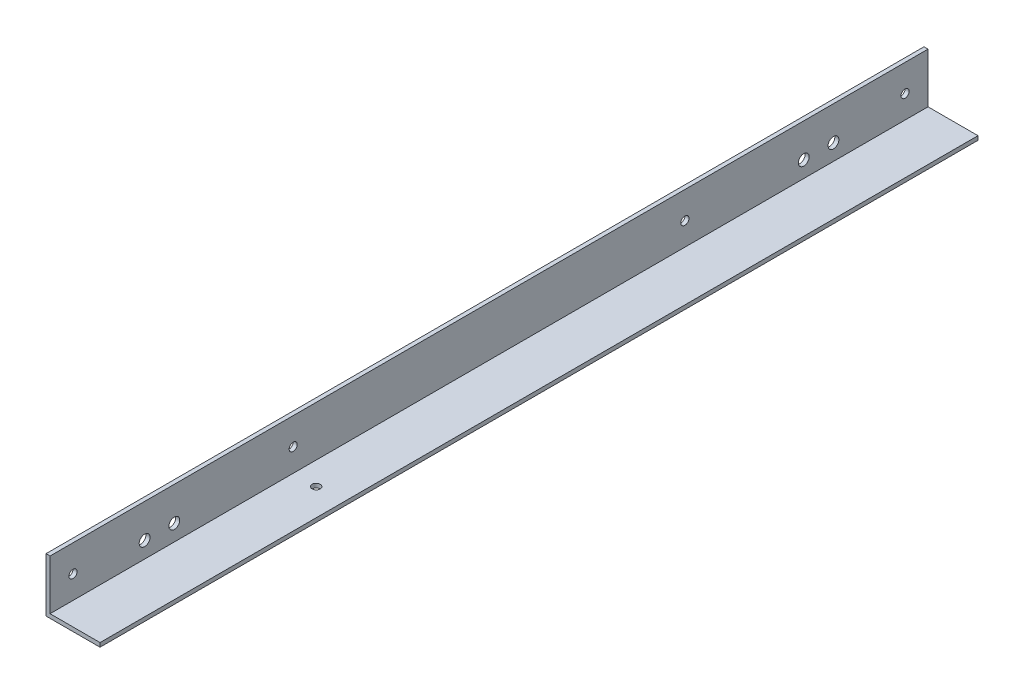
ISO-10303-21;
HEADER;
FILE_DESCRIPTION(('STEP AP214'),'2;1');
FILE_NAME('part.step','',(''),(''),'','','');
FILE_SCHEMA(('AUTOMOTIVE_DESIGN { 1 0 10303 214 1 1 1 1 }'));
ENDSEC;
DATA;
#1=APPLICATION_CONTEXT('core data for automotive mechanical design processes');
#2=APPLICATION_PROTOCOL_DEFINITION('international standard','automotive_design',2000,#1);
#3=PRODUCT_CONTEXT('',#1,'mechanical');
#4=PRODUCT('Part','Part','',(#3));
#5=PRODUCT_RELATED_PRODUCT_CATEGORY('part','',(#4));
#6=PRODUCT_DEFINITION_FORMATION('','',#4);
#7=PRODUCT_DEFINITION_CONTEXT('part definition',#1,'design');
#8=PRODUCT_DEFINITION('design','',#6,#7);
#9=PRODUCT_DEFINITION_SHAPE('','',#8);
#10=(LENGTH_UNIT() NAMED_UNIT(*) SI_UNIT(.MILLI.,.METRE.));
#11=(NAMED_UNIT(*) PLANE_ANGLE_UNIT() SI_UNIT($,.RADIAN.));
#12=(NAMED_UNIT(*) SI_UNIT($,.STERADIAN.) SOLID_ANGLE_UNIT());
#13=UNCERTAINTY_MEASURE_WITH_UNIT(LENGTH_MEASURE(1.E-05),#10,'distance_accuracy_value','');
#14=(GEOMETRIC_REPRESENTATION_CONTEXT(3) GLOBAL_UNCERTAINTY_ASSIGNED_CONTEXT((#13)) GLOBAL_UNIT_ASSIGNED_CONTEXT((#10,
#11,#12)) REPRESENTATION_CONTEXT('',''));
#15=CARTESIAN_POINT('',(0.,0.,0.));
#16=DIRECTION('',(0.,0.,1.));
#17=DIRECTION('',(1.,0.,0.));
#18=AXIS2_PLACEMENT_3D('',#15,#16,#17);
#19=CARTESIAN_POINT('',(-15.9316863798358,4.77336842105263,325.));
#20=DIRECTION('',(0.,-1.,0.));
#21=DIRECTION('',(1.,0.,0.));
#22=AXIS2_PLACEMENT_3D('',#19,#20,#21);
#23=PLANE('',#22);
#24=DIRECTION('',(-1.,0.,0.));
#25=VECTOR('',#24,1.);
#26=CARTESIAN_POINT('',(-15.9316863798358,4.77336842105263,0.));
#27=LINE('',#26,#25);
#28=CARTESIAN_POINT('',(-15.9316863798358,4.77336842105263,0.));
#29=VERTEX_POINT('',#28);
#30=CARTESIAN_POINT('',(-17.4316863798358,4.77336842105263,0.));
#31=VERTEX_POINT('',#30);
#32=EDGE_CURVE('E116',#29,#31,#27,.T.);
#33=ORIENTED_EDGE('',*,*,#32,.T.);
#34=DIRECTION('',(0.,0.,-1.));
#35=VECTOR('',#34,1.);
#36=CARTESIAN_POINT('',(-17.4316863798358,4.77336842105263,325.));
#37=LINE('',#36,#35);
#38=CARTESIAN_POINT('',(-17.4316863798358,4.77336842105263,325.));
#39=VERTEX_POINT('',#38);
#40=EDGE_CURVE('E11',#39,#31,#37,.T.);
#41=ORIENTED_EDGE('',*,*,#40,.F.);
#42=DIRECTION('',(-1.,0.,0.));
#43=VECTOR('',#42,1.);
#44=CARTESIAN_POINT('',(-15.9316863798358,4.77336842105263,325.));
#45=LINE('',#44,#43);
#46=CARTESIAN_POINT('',(-15.9316863798358,4.77336842105263,325.));
#47=VERTEX_POINT('',#46);
#48=EDGE_CURVE('E127',#47,#39,#45,.T.);
#49=ORIENTED_EDGE('',*,*,#48,.F.);
#50=DIRECTION('',(0.,0.,-1.));
#51=VECTOR('',#50,1.);
#52=CARTESIAN_POINT('',(-15.9316863798358,4.77336842105263,325.));
#53=LINE('',#52,#51);
#54=EDGE_CURVE('E112',#47,#29,#53,.T.);
#55=ORIENTED_EDGE('',*,*,#54,.T.);
#56=EDGE_LOOP('',(#33,#41,#49,#55));
#57=FACE_BOUND('',#56,.T.);
#58=ADVANCED_FACE('F31',(#57),#23,.F.);
#59=CARTESIAN_POINT('',(-17.4316863798358,4.77336842105263,325.));
#60=DIRECTION('',(1.,0.,0.));
#61=DIRECTION('',(0.,1.,0.));
#62=AXIS2_PLACEMENT_3D('',#59,#60,#61);
#63=PLANE('',#62);
#64=CARTESIAN_POINT('',(-17.4316863798358,-5.22663157894737,90.));
#65=DIRECTION('',(1.,0.,0.));
#66=DIRECTION('',(0.,1.,0.));
#67=AXIS2_PLACEMENT_3D('',#64,#65,#66);
#68=CIRCLE('',#67,1.5);
#69=CARTESIAN_POINT('',(-17.4316863798358,-3.72663157894737,90.));
#70=VERTEX_POINT('',#69);
#71=EDGE_CURVE('E351',#70,#70,#68,.T.);
#72=ORIENTED_EDGE('',*,*,#71,.T.);
#73=EDGE_LOOP('',(#72));
#74=FACE_BOUND('',#73,.T.);
#75=CARTESIAN_POINT('',(-17.4316863798358,-5.22663157894737,235.));
#76=DIRECTION('',(1.,0.,0.));
#77=DIRECTION('',(0.,1.,0.));
#78=AXIS2_PLACEMENT_3D('',#75,#76,#77);
#79=CIRCLE('',#78,1.50000000000003);
#80=CARTESIAN_POINT('',(-17.4316863798358,-3.72663157894734,235.));
#81=VERTEX_POINT('',#80);
#82=EDGE_CURVE('E345',#81,#81,#79,.T.);
#83=ORIENTED_EDGE('',*,*,#82,.T.);
#84=EDGE_LOOP('',(#83));
#85=FACE_BOUND('',#84,.T.);
#86=CARTESIAN_POINT('',(-17.4316863798358,-7.72663157894737,46.));
#87=DIRECTION('',(1.,0.,0.));
#88=DIRECTION('',(0.,1.,0.));
#89=AXIS2_PLACEMENT_3D('',#86,#87,#88);
#90=CIRCLE('',#89,2.);
#91=CARTESIAN_POINT('',(-17.4316863798358,-5.72663157894737,46.));
#92=VERTEX_POINT('',#91);
#93=EDGE_CURVE('E339',#92,#92,#90,.T.);
#94=ORIENTED_EDGE('',*,*,#93,.T.);
#95=EDGE_LOOP('',(#94));
#96=FACE_BOUND('',#95,.T.);
#97=CARTESIAN_POINT('',(-17.4316863798358,-7.72663157894737,35.));
#98=DIRECTION('',(1.,0.,0.));
#99=DIRECTION('',(0.,1.,0.));
#100=AXIS2_PLACEMENT_3D('',#97,#98,#99);
#101=CIRCLE('',#100,2.);
#102=CARTESIAN_POINT('',(-17.4316863798358,-5.72663157894737,35.));
#103=VERTEX_POINT('',#102);
#104=EDGE_CURVE('E333',#103,#103,#101,.T.);
#105=ORIENTED_EDGE('',*,*,#104,.T.);
#106=EDGE_LOOP('',(#105));
#107=FACE_BOUND('',#106,.T.);
#108=CARTESIAN_POINT('',(-17.4316863798358,-7.72663157894737,279.));
#109=DIRECTION('',(1.,0.,0.));
#110=DIRECTION('',(0.,1.,0.));
#111=AXIS2_PLACEMENT_3D('',#108,#109,#110);
#112=CIRCLE('',#111,2.);
#113=CARTESIAN_POINT('',(-17.4316863798358,-5.72663157894738,279.));
#114=VERTEX_POINT('',#113);
#115=EDGE_CURVE('E327',#114,#114,#112,.T.);
#116=ORIENTED_EDGE('',*,*,#115,.T.);
#117=EDGE_LOOP('',(#116));
#118=FACE_BOUND('',#117,.T.);
#119=CARTESIAN_POINT('',(-17.4316863798358,-7.72663157894737,290.));
#120=DIRECTION('',(1.,0.,0.));
#121=DIRECTION('',(0.,1.,0.));
#122=AXIS2_PLACEMENT_3D('',#119,#120,#121);
#123=CIRCLE('',#122,2.);
#124=CARTESIAN_POINT('',(-17.4316863798358,-5.72663157894738,290.));
#125=VERTEX_POINT('',#124);
#126=EDGE_CURVE('E321',#125,#125,#123,.T.);
#127=ORIENTED_EDGE('',*,*,#126,.T.);
#128=EDGE_LOOP('',(#127));
#129=FACE_BOUND('',#128,.T.);
#130=CARTESIAN_POINT('',(-17.4316863798358,-5.22663157894737,8.50000000000001));
#131=DIRECTION('',(1.,0.,0.));
#132=DIRECTION('',(0.,1.,0.));
#133=AXIS2_PLACEMENT_3D('',#130,#131,#132);
#134=CIRCLE('',#133,1.5);
#135=CARTESIAN_POINT('',(-17.4316863798358,-3.72663157894737,8.50000000000001));
#136=VERTEX_POINT('',#135);
#137=EDGE_CURVE('E311',#136,#136,#134,.T.);
#138=ORIENTED_EDGE('',*,*,#137,.T.);
#139=EDGE_LOOP('',(#138));
#140=FACE_BOUND('',#139,.T.);
#141=CARTESIAN_POINT('',(-17.4316863798358,-5.22663157894737,316.5));
#142=DIRECTION('',(1.,0.,0.));
#143=DIRECTION('',(0.,1.,0.));
#144=AXIS2_PLACEMENT_3D('',#141,#142,#143);
#145=CIRCLE('',#144,1.50000000000002);
#146=CARTESIAN_POINT('',(-17.4316863798358,-3.72663157894735,316.5));
#147=VERTEX_POINT('',#146);
#148=EDGE_CURVE('E120',#147,#147,#145,.T.);
#149=ORIENTED_EDGE('',*,*,#148,.T.);
#150=EDGE_LOOP('',(#149));
#151=FACE_BOUND('',#150,.T.);
#152=DIRECTION('',(0.,-1.,0.));
#153=VECTOR('',#152,1.);
#154=CARTESIAN_POINT('',(-17.4316863798358,4.77336842105263,0.));
#155=LINE('',#154,#153);
#156=CARTESIAN_POINT('',(-17.4316863798357,-15.2266315789474,0.));
#157=VERTEX_POINT('',#156);
#158=EDGE_CURVE('E119',#31,#157,#155,.T.);
#159=ORIENTED_EDGE('',*,*,#158,.T.);
#160=DIRECTION('',(0.,0.,-1.));
#161=VECTOR('',#160,1.);
#162=CARTESIAN_POINT('',(-17.4316863798357,-15.2266315789474,325.));
#163=LINE('',#162,#161);
#164=CARTESIAN_POINT('',(-17.4316863798357,-15.2266315789474,325.));
#165=VERTEX_POINT('',#164);
#166=EDGE_CURVE('E40',#165,#157,#163,.T.);
#167=ORIENTED_EDGE('',*,*,#166,.F.);
#168=DIRECTION('',(0.,-1.,0.));
#169=VECTOR('',#168,1.);
#170=CARTESIAN_POINT('',(-17.4316863798358,4.77336842105263,325.));
#171=LINE('',#170,#169);
#172=EDGE_CURVE('E85',#39,#165,#171,.T.);
#173=ORIENTED_EDGE('',*,*,#172,.F.);
#174=ORIENTED_EDGE('',*,*,#40,.T.);
#175=EDGE_LOOP('',(#159,#167,#173,#174));
#176=FACE_BOUND('',#175,.T.);
#177=ADVANCED_FACE('F156',(#74,#85,#96,#107,#118,#129,#140,#151,#176),#63,.F.);
#178=CARTESIAN_POINT('',(-17.4316863798357,-15.2266315789474,325.));
#179=DIRECTION('',(0.,1.,0.));
#180=DIRECTION('',(0.,0.,1.));
#181=AXIS2_PLACEMENT_3D('',#178,#179,#180);
#182=PLANE('',#181);
#183=CARTESIAN_POINT('',(-7.43168637983575,-15.2266315789474,235.));
#184=DIRECTION('',(0.,-1.,0.));
#185=DIRECTION('',(0.,0.,-1.));
#186=AXIS2_PLACEMENT_3D('',#183,#184,#185);
#187=CIRCLE('',#186,1.5);
#188=CARTESIAN_POINT('',(-7.43168637983575,-15.2266315789474,233.5));
#189=VERTEX_POINT('',#188);
#190=EDGE_CURVE('E356',#189,#189,#187,.T.);
#191=ORIENTED_EDGE('',*,*,#190,.F.);
#192=EDGE_LOOP('',(#191));
#193=FACE_BOUND('',#192,.T.);
#194=DIRECTION('',(1.,0.,0.));
#195=VECTOR('',#194,1.);
#196=CARTESIAN_POINT('',(-17.4316863798357,-15.2266315789474,0.));
#197=LINE('',#196,#195);
#198=CARTESIAN_POINT('',(2.56831362016425,-15.2266315789474,0.));
#199=VERTEX_POINT('',#198);
#200=EDGE_CURVE('E122',#157,#199,#197,.T.);
#201=ORIENTED_EDGE('',*,*,#200,.T.);
#202=DIRECTION('',(0.,0.,-1.));
#203=VECTOR('',#202,1.);
#204=CARTESIAN_POINT('',(2.56831362016425,-15.2266315789474,325.));
#205=LINE('',#204,#203);
#206=CARTESIAN_POINT('',(2.56831362016425,-15.2266315789474,325.));
#207=VERTEX_POINT('',#206);
#208=EDGE_CURVE('E107',#207,#199,#205,.T.);
#209=ORIENTED_EDGE('',*,*,#208,.F.);
#210=DIRECTION('',(1.,0.,0.));
#211=VECTOR('',#210,1.);
#212=CARTESIAN_POINT('',(-17.4316863798357,-15.2266315789474,325.));
#213=LINE('',#212,#211);
#214=EDGE_CURVE('E98',#165,#207,#213,.T.);
#215=ORIENTED_EDGE('',*,*,#214,.F.);
#216=ORIENTED_EDGE('',*,*,#166,.T.);
#217=EDGE_LOOP('',(#201,#209,#215,#216));
#218=FACE_BOUND('',#217,.T.);
#219=ADVANCED_FACE('F134',(#193,#218),#182,.F.);
#220=CARTESIAN_POINT('',(2.56831362016425,-15.2266315789474,325.));
#221=DIRECTION('',(-1.,0.,0.));
#222=DIRECTION('',(0.,0.,1.));
#223=AXIS2_PLACEMENT_3D('',#220,#221,#222);
#224=PLANE('',#223);
#225=DIRECTION('',(0.,1.,0.));
#226=VECTOR('',#225,1.);
#227=CARTESIAN_POINT('',(2.56831362016425,-15.2266315789474,0.));
#228=LINE('',#227,#226);
#229=CARTESIAN_POINT('',(2.56831362016425,-13.7266315789474,0.));
#230=VERTEX_POINT('',#229);
#231=EDGE_CURVE('E106',#199,#230,#228,.T.);
#232=ORIENTED_EDGE('',*,*,#231,.T.);
#233=DIRECTION('',(0.,0.,-1.));
#234=VECTOR('',#233,1.);
#235=CARTESIAN_POINT('',(2.56831362016425,-13.7266315789474,325.));
#236=LINE('',#235,#234);
#237=CARTESIAN_POINT('',(2.56831362016425,-13.7266315789474,325.));
#238=VERTEX_POINT('',#237);
#239=EDGE_CURVE('E103',#238,#230,#236,.T.);
#240=ORIENTED_EDGE('',*,*,#239,.F.);
#241=DIRECTION('',(0.,1.,0.));
#242=VECTOR('',#241,1.);
#243=CARTESIAN_POINT('',(2.56831362016425,-15.2266315789474,325.));
#244=LINE('',#243,#242);
#245=EDGE_CURVE('E92',#207,#238,#244,.T.);
#246=ORIENTED_EDGE('',*,*,#245,.F.);
#247=ORIENTED_EDGE('',*,*,#208,.T.);
#248=EDGE_LOOP('',(#232,#240,#246,#247));
#249=FACE_BOUND('',#248,.T.);
#250=ADVANCED_FACE('F104',(#249),#224,.F.);
#251=CARTESIAN_POINT('',(2.56831362016425,-13.7266315789474,325.));
#252=DIRECTION('',(0.,-1.,0.));
#253=DIRECTION('',(1.,0.,0.));
#254=AXIS2_PLACEMENT_3D('',#251,#252,#253);
#255=PLANE('',#254);
#256=CARTESIAN_POINT('',(-7.43168637983575,-13.7266315789474,235.));
#257=DIRECTION('',(0.,-1.,0.));
#258=DIRECTION('',(1.,0.,0.));
#259=AXIS2_PLACEMENT_3D('',#256,#257,#258);
#260=CIRCLE('',#259,1.5);
#261=CARTESIAN_POINT('',(-5.93168637983575,-13.7266315789474,235.));
#262=VERTEX_POINT('',#261);
#263=EDGE_CURVE('E34',#262,#262,#260,.T.);
#264=ORIENTED_EDGE('',*,*,#263,.T.);
#265=EDGE_LOOP('',(#264));
#266=FACE_BOUND('',#265,.T.);
#267=DIRECTION('',(-1.,0.,0.));
#268=VECTOR('',#267,1.);
#269=CARTESIAN_POINT('',(2.56831362016425,-13.7266315789474,0.));
#270=LINE('',#269,#268);
#271=CARTESIAN_POINT('',(-15.9316863798358,-13.7266315789474,0.));
#272=VERTEX_POINT('',#271);
#273=EDGE_CURVE('E71',#230,#272,#270,.T.);
#274=ORIENTED_EDGE('',*,*,#273,.T.);
#275=DIRECTION('',(0.,0.,-1.));
#276=VECTOR('',#275,1.);
#277=CARTESIAN_POINT('',(-15.9316863798358,-13.7266315789474,325.));
#278=LINE('',#277,#276);
#279=CARTESIAN_POINT('',(-15.9316863798358,-13.7266315789474,325.));
#280=VERTEX_POINT('',#279);
#281=EDGE_CURVE('E108',#280,#272,#278,.T.);
#282=ORIENTED_EDGE('',*,*,#281,.F.);
#283=DIRECTION('',(-1.,0.,0.));
#284=VECTOR('',#283,1.);
#285=CARTESIAN_POINT('',(2.56831362016425,-13.7266315789474,325.));
#286=LINE('',#285,#284);
#287=EDGE_CURVE('E96',#238,#280,#286,.T.);
#288=ORIENTED_EDGE('',*,*,#287,.F.);
#289=ORIENTED_EDGE('',*,*,#239,.T.);
#290=EDGE_LOOP('',(#274,#282,#288,#289));
#291=FACE_BOUND('',#290,.T.);
#292=ADVANCED_FACE('F110',(#266,#291),#255,.F.);
#293=CARTESIAN_POINT('',(-15.9316863798358,-13.7266315789474,325.));
#294=DIRECTION('',(-1.,0.,0.));
#295=DIRECTION('',(0.,0.,1.));
#296=AXIS2_PLACEMENT_3D('',#293,#294,#295);
#297=PLANE('',#296);
#298=CARTESIAN_POINT('',(-15.9316863798358,-5.22663157894737,90.));
#299=DIRECTION('',(1.,0.,0.));
#300=DIRECTION('',(0.,0.,-1.));
#301=AXIS2_PLACEMENT_3D('',#298,#299,#300);
#302=CIRCLE('',#301,1.5);
#303=CARTESIAN_POINT('',(-15.9316863798358,-5.22663157894737,88.5));
#304=VERTEX_POINT('',#303);
#305=EDGE_CURVE('E353',#304,#304,#302,.T.);
#306=ORIENTED_EDGE('',*,*,#305,.F.);
#307=EDGE_LOOP('',(#306));
#308=FACE_BOUND('',#307,.T.);
#309=CARTESIAN_POINT('',(-15.9316863798358,-5.22663157894737,235.));
#310=DIRECTION('',(1.,0.,0.));
#311=DIRECTION('',(0.,0.,-1.));
#312=AXIS2_PLACEMENT_3D('',#309,#310,#311);
#313=CIRCLE('',#312,1.50000000000003);
#314=CARTESIAN_POINT('',(-15.9316863798358,-5.22663157894737,233.5));
#315=VERTEX_POINT('',#314);
#316=EDGE_CURVE('E348',#315,#315,#313,.T.);
#317=ORIENTED_EDGE('',*,*,#316,.F.);
#318=EDGE_LOOP('',(#317));
#319=FACE_BOUND('',#318,.T.);
#320=CARTESIAN_POINT('',(-15.9316863798358,-7.72663157894737,46.));
#321=DIRECTION('',(1.,0.,0.));
#322=DIRECTION('',(0.,0.,-1.));
#323=AXIS2_PLACEMENT_3D('',#320,#321,#322);
#324=CIRCLE('',#323,2.);
#325=CARTESIAN_POINT('',(-15.9316863798358,-7.72663157894737,44.));
#326=VERTEX_POINT('',#325);
#327=EDGE_CURVE('E342',#326,#326,#324,.T.);
#328=ORIENTED_EDGE('',*,*,#327,.F.);
#329=EDGE_LOOP('',(#328));
#330=FACE_BOUND('',#329,.T.);
#331=CARTESIAN_POINT('',(-15.9316863798358,-7.72663157894737,35.));
#332=DIRECTION('',(1.,0.,0.));
#333=DIRECTION('',(0.,0.,-1.));
#334=AXIS2_PLACEMENT_3D('',#331,#332,#333);
#335=CIRCLE('',#334,2.);
#336=CARTESIAN_POINT('',(-15.9316863798358,-7.72663157894737,33.));
#337=VERTEX_POINT('',#336);
#338=EDGE_CURVE('E336',#337,#337,#335,.T.);
#339=ORIENTED_EDGE('',*,*,#338,.F.);
#340=EDGE_LOOP('',(#339));
#341=FACE_BOUND('',#340,.T.);
#342=CARTESIAN_POINT('',(-15.9316863798358,-7.72663157894737,279.));
#343=DIRECTION('',(1.,0.,0.));
#344=DIRECTION('',(0.,0.,-1.));
#345=AXIS2_PLACEMENT_3D('',#342,#343,#344);
#346=CIRCLE('',#345,2.);
#347=CARTESIAN_POINT('',(-15.9316863798358,-7.72663157894737,277.));
#348=VERTEX_POINT('',#347);
#349=EDGE_CURVE('E330',#348,#348,#346,.T.);
#350=ORIENTED_EDGE('',*,*,#349,.F.);
#351=EDGE_LOOP('',(#350));
#352=FACE_BOUND('',#351,.T.);
#353=CARTESIAN_POINT('',(-15.9316863798358,-7.72663157894737,290.));
#354=DIRECTION('',(1.,0.,0.));
#355=DIRECTION('',(0.,0.,-1.));
#356=AXIS2_PLACEMENT_3D('',#353,#354,#355);
#357=CIRCLE('',#356,2.);
#358=CARTESIAN_POINT('',(-15.9316863798358,-7.72663157894737,288.));
#359=VERTEX_POINT('',#358);
#360=EDGE_CURVE('E324',#359,#359,#357,.T.);
#361=ORIENTED_EDGE('',*,*,#360,.F.);
#362=EDGE_LOOP('',(#361));
#363=FACE_BOUND('',#362,.T.);
#364=CARTESIAN_POINT('',(-15.9316863798358,-5.22663157894737,8.50000000000001));
#365=DIRECTION('',(1.,0.,0.));
#366=DIRECTION('',(0.,0.,-1.));
#367=AXIS2_PLACEMENT_3D('',#364,#365,#366);
#368=CIRCLE('',#367,1.5);
#369=CARTESIAN_POINT('',(-15.9316863798358,-5.22663157894737,7.00000000000001));
#370=VERTEX_POINT('',#369);
#371=EDGE_CURVE('E318',#370,#370,#368,.T.);
#372=ORIENTED_EDGE('',*,*,#371,.F.);
#373=EDGE_LOOP('',(#372));
#374=FACE_BOUND('',#373,.T.);
#375=CARTESIAN_POINT('',(-15.9316863798358,-5.22663157894737,316.5));
#376=DIRECTION('',(1.,0.,0.));
#377=DIRECTION('',(0.,0.,-1.));
#378=AXIS2_PLACEMENT_3D('',#375,#376,#377);
#379=CIRCLE('',#378,1.50000000000002);
#380=CARTESIAN_POINT('',(-15.9316863798358,-5.22663157894737,315.));
#381=VERTEX_POINT('',#380);
#382=EDGE_CURVE('E306',#381,#381,#379,.T.);
#383=ORIENTED_EDGE('',*,*,#382,.F.);
#384=EDGE_LOOP('',(#383));
#385=FACE_BOUND('',#384,.T.);
#386=DIRECTION('',(0.,1.,0.));
#387=VECTOR('',#386,1.);
#388=CARTESIAN_POINT('',(-15.9316863798358,-13.7266315789474,0.));
#389=LINE('',#388,#387);
#390=EDGE_CURVE('E77',#272,#29,#389,.T.);
#391=ORIENTED_EDGE('',*,*,#390,.T.);
#392=ORIENTED_EDGE('',*,*,#54,.F.);
#393=DIRECTION('',(0.,1.,0.));
#394=VECTOR('',#393,1.);
#395=CARTESIAN_POINT('',(-15.9316863798358,-13.7266315789474,325.));
#396=LINE('',#395,#394);
#397=EDGE_CURVE('E48',#280,#47,#396,.T.);
#398=ORIENTED_EDGE('',*,*,#397,.F.);
#399=ORIENTED_EDGE('',*,*,#281,.T.);
#400=EDGE_LOOP('',(#391,#392,#398,#399));
#401=FACE_BOUND('',#400,.T.);
#402=ADVANCED_FACE('F141',(#308,#319,#330,#341,#352,#363,#374,#385,#401),#297,.F.);
#403=CARTESIAN_POINT('',(-17.4316863798358,4.77336842105263,325.));
#404=DIRECTION('',(0.,0.,1.));
#405=DIRECTION('',(1.,0.,0.));
#406=AXIS2_PLACEMENT_3D('',#403,#404,#405);
#407=PLANE('',#406);
#408=ORIENTED_EDGE('',*,*,#48,.T.);
#409=ORIENTED_EDGE('',*,*,#172,.T.);
#410=ORIENTED_EDGE('',*,*,#214,.T.);
#411=ORIENTED_EDGE('',*,*,#245,.T.);
#412=ORIENTED_EDGE('',*,*,#287,.T.);
#413=ORIENTED_EDGE('',*,*,#397,.T.);
#414=EDGE_LOOP('',(#408,#409,#410,#411,#412,#413));
#415=FACE_BOUND('',#414,.T.);
#416=ADVANCED_FACE('F94',(#415),#407,.T.);
#417=CARTESIAN_POINT('',(-17.4316863798358,4.77336842105263,0.));
#418=DIRECTION('',(0.,0.,1.));
#419=DIRECTION('',(1.,0.,0.));
#420=AXIS2_PLACEMENT_3D('',#417,#418,#419);
#421=PLANE('',#420);
#422=ORIENTED_EDGE('',*,*,#32,.F.);
#423=ORIENTED_EDGE('',*,*,#390,.F.);
#424=ORIENTED_EDGE('',*,*,#273,.F.);
#425=ORIENTED_EDGE('',*,*,#231,.F.);
#426=ORIENTED_EDGE('',*,*,#200,.F.);
#427=ORIENTED_EDGE('',*,*,#158,.F.);
#428=EDGE_LOOP('',(#422,#423,#424,#425,#426,#427));
#429=FACE_BOUND('',#428,.T.);
#430=ADVANCED_FACE('F137',(#429),#421,.F.);
#431=CARTESIAN_POINT('',(-315.931686379836,-5.22663157894737,316.5));
#432=DIRECTION('',(1.,0.,0.));
#433=DIRECTION('',(0.,0.,-1.));
#434=AXIS2_PLACEMENT_3D('',#431,#432,#433);
#435=CYLINDRICAL_SURFACE('',#434,1.50000000000002);
#436=ORIENTED_EDGE('',*,*,#382,.T.);
#437=EDGE_LOOP('',(#436));
#438=FACE_BOUND('',#437,.T.);
#439=ORIENTED_EDGE('',*,*,#148,.F.);
#440=EDGE_LOOP('',(#439));
#441=FACE_BOUND('',#440,.T.);
#442=ADVANCED_FACE('F249',(#438,#441),#435,.F.);
#443=CARTESIAN_POINT('',(-315.931686379836,-5.22663157894737,8.50000000000001));
#444=DIRECTION('',(1.,0.,0.));
#445=DIRECTION('',(0.,0.,-1.));
#446=AXIS2_PLACEMENT_3D('',#443,#444,#445);
#447=CYLINDRICAL_SURFACE('',#446,1.5);
#448=ORIENTED_EDGE('',*,*,#371,.T.);
#449=EDGE_LOOP('',(#448));
#450=FACE_BOUND('',#449,.T.);
#451=ORIENTED_EDGE('',*,*,#137,.F.);
#452=EDGE_LOOP('',(#451));
#453=FACE_BOUND('',#452,.T.);
#454=ADVANCED_FACE('F241',(#450,#453),#447,.F.);
#455=CARTESIAN_POINT('',(-315.931686379836,-7.72663157894737,290.));
#456=DIRECTION('',(1.,0.,0.));
#457=DIRECTION('',(0.,0.,-1.));
#458=AXIS2_PLACEMENT_3D('',#455,#456,#457);
#459=CYLINDRICAL_SURFACE('',#458,2.);
#460=ORIENTED_EDGE('',*,*,#360,.T.);
#461=EDGE_LOOP('',(#460));
#462=FACE_BOUND('',#461,.T.);
#463=ORIENTED_EDGE('',*,*,#126,.F.);
#464=EDGE_LOOP('',(#463));
#465=FACE_BOUND('',#464,.T.);
#466=ADVANCED_FACE('F233',(#462,#465),#459,.F.);
#467=CARTESIAN_POINT('',(-315.931686379836,-7.72663157894737,279.));
#468=DIRECTION('',(1.,0.,0.));
#469=DIRECTION('',(0.,0.,-1.));
#470=AXIS2_PLACEMENT_3D('',#467,#468,#469);
#471=CYLINDRICAL_SURFACE('',#470,2.);
#472=ORIENTED_EDGE('',*,*,#349,.T.);
#473=EDGE_LOOP('',(#472));
#474=FACE_BOUND('',#473,.T.);
#475=ORIENTED_EDGE('',*,*,#115,.F.);
#476=EDGE_LOOP('',(#475));
#477=FACE_BOUND('',#476,.T.);
#478=ADVANCED_FACE('F225',(#474,#477),#471,.F.);
#479=CARTESIAN_POINT('',(-315.931686379836,-7.72663157894737,35.));
#480=DIRECTION('',(1.,0.,0.));
#481=DIRECTION('',(0.,0.,-1.));
#482=AXIS2_PLACEMENT_3D('',#479,#480,#481);
#483=CYLINDRICAL_SURFACE('',#482,2.);
#484=ORIENTED_EDGE('',*,*,#338,.T.);
#485=EDGE_LOOP('',(#484));
#486=FACE_BOUND('',#485,.T.);
#487=ORIENTED_EDGE('',*,*,#104,.F.);
#488=EDGE_LOOP('',(#487));
#489=FACE_BOUND('',#488,.T.);
#490=ADVANCED_FACE('F217',(#486,#489),#483,.F.);
#491=CARTESIAN_POINT('',(-315.931686379836,-7.72663157894737,46.));
#492=DIRECTION('',(1.,0.,0.));
#493=DIRECTION('',(0.,0.,-1.));
#494=AXIS2_PLACEMENT_3D('',#491,#492,#493);
#495=CYLINDRICAL_SURFACE('',#494,2.);
#496=ORIENTED_EDGE('',*,*,#327,.T.);
#497=EDGE_LOOP('',(#496));
#498=FACE_BOUND('',#497,.T.);
#499=ORIENTED_EDGE('',*,*,#93,.F.);
#500=EDGE_LOOP('',(#499));
#501=FACE_BOUND('',#500,.T.);
#502=ADVANCED_FACE('F209',(#498,#501),#495,.F.);
#503=CARTESIAN_POINT('',(-315.931686379836,-5.22663157894737,235.));
#504=DIRECTION('',(1.,0.,0.));
#505=DIRECTION('',(0.,0.,-1.));
#506=AXIS2_PLACEMENT_3D('',#503,#504,#505);
#507=CYLINDRICAL_SURFACE('',#506,1.50000000000003);
#508=ORIENTED_EDGE('',*,*,#316,.T.);
#509=EDGE_LOOP('',(#508));
#510=FACE_BOUND('',#509,.T.);
#511=ORIENTED_EDGE('',*,*,#82,.F.);
#512=EDGE_LOOP('',(#511));
#513=FACE_BOUND('',#512,.T.);
#514=ADVANCED_FACE('F202',(#510,#513),#507,.F.);
#515=CARTESIAN_POINT('',(-315.931686379836,-5.22663157894737,90.));
#516=DIRECTION('',(1.,0.,0.));
#517=DIRECTION('',(0.,0.,-1.));
#518=AXIS2_PLACEMENT_3D('',#515,#516,#517);
#519=CYLINDRICAL_SURFACE('',#518,1.5);
#520=ORIENTED_EDGE('',*,*,#305,.T.);
#521=EDGE_LOOP('',(#520));
#522=FACE_BOUND('',#521,.T.);
#523=ORIENTED_EDGE('',*,*,#71,.F.);
#524=EDGE_LOOP('',(#523));
#525=FACE_BOUND('',#524,.T.);
#526=ADVANCED_FACE('F192',(#522,#525),#519,.F.);
#527=CARTESIAN_POINT('',(-7.43168637983575,-5.22663157894737,235.));
#528=DIRECTION('',(0.,-1.,0.));
#529=DIRECTION('',(0.,0.,-1.));
#530=AXIS2_PLACEMENT_3D('',#527,#528,#529);
#531=CYLINDRICAL_SURFACE('',#530,1.5);
#532=ORIENTED_EDGE('',*,*,#190,.T.);
#533=EDGE_LOOP('',(#532));
#534=FACE_BOUND('',#533,.T.);
#535=ORIENTED_EDGE('',*,*,#263,.F.);
#536=EDGE_LOOP('',(#535));
#537=FACE_BOUND('',#536,.T.);
#538=ADVANCED_FACE('F188',(#534,#537),#531,.F.);
#539=CLOSED_SHELL('',(#58,#177,#219,#250,#292,#402,#416,#430,#442,#454,#466,#478,#490,#502,#514,
#526,#538));
#540=MANIFOLD_SOLID_BREP('B2',#539);
#541=ADVANCED_BREP_SHAPE_REPRESENTATION('',(#18,#540),#14);
#542=SHAPE_DEFINITION_REPRESENTATION(#9,#541);
ENDSEC;
END-ISO-10303-21;
